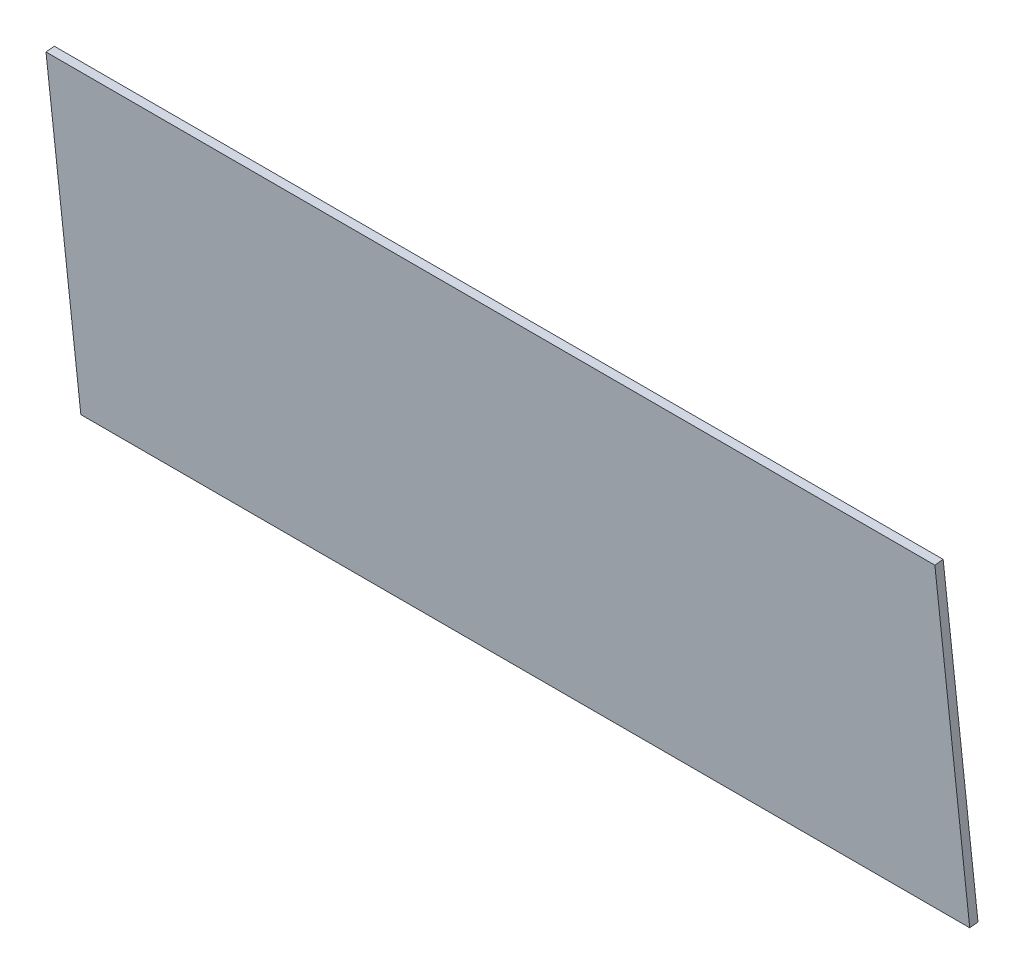
ISO-10303-21;
HEADER;
FILE_DESCRIPTION(('STEP AP214'),'2;1');
FILE_NAME('part.step','',(''),(''),'','','');
FILE_SCHEMA(('AUTOMOTIVE_DESIGN { 1 0 10303 214 1 1 1 1 }'));
ENDSEC;
DATA;
#1=APPLICATION_CONTEXT('core data for automotive mechanical design processes');
#2=APPLICATION_PROTOCOL_DEFINITION('international standard','automotive_design',2000,#1);
#3=PRODUCT_CONTEXT('',#1,'mechanical');
#4=PRODUCT('Part','Part','',(#3));
#5=PRODUCT_RELATED_PRODUCT_CATEGORY('part','',(#4));
#6=PRODUCT_DEFINITION_FORMATION('','',#4);
#7=PRODUCT_DEFINITION_CONTEXT('part definition',#1,'design');
#8=PRODUCT_DEFINITION('design','',#6,#7);
#9=PRODUCT_DEFINITION_SHAPE('','',#8);
#10=(LENGTH_UNIT() NAMED_UNIT(*) SI_UNIT(.MILLI.,.METRE.));
#11=(NAMED_UNIT(*) PLANE_ANGLE_UNIT() SI_UNIT($,.RADIAN.));
#12=(NAMED_UNIT(*) SI_UNIT($,.STERADIAN.) SOLID_ANGLE_UNIT());
#13=UNCERTAINTY_MEASURE_WITH_UNIT(LENGTH_MEASURE(1.E-05),#10,'distance_accuracy_value','');
#14=(GEOMETRIC_REPRESENTATION_CONTEXT(3) GLOBAL_UNCERTAINTY_ASSIGNED_CONTEXT((#13)) GLOBAL_UNIT_ASSIGNED_CONTEXT((#10,
#11,#12)) REPRESENTATION_CONTEXT('',''));
#15=CARTESIAN_POINT('',(0.,0.,0.));
#16=DIRECTION('',(0.,0.,1.));
#17=DIRECTION('',(1.,0.,0.));
#18=AXIS2_PLACEMENT_3D('',#15,#16,#17);
#19=CARTESIAN_POINT('',(-83.0377223575488,-1054.44376842487,-317.862707272272));
#20=DIRECTION('',(1.,0.,0.));
#21=DIRECTION('',(0.,1.,0.));
#22=AXIS2_PLACEMENT_3D('',#19,#20,#21);
#23=PLANE('',#22);
#24=DIRECTION('',(0.,-0.994521895368273,-0.104528463267653));
#25=VECTOR('',#24,1.);
#26=CARTESIAN_POINT('',(-83.0377223575488,-1054.13018303507,-320.846272958377));
#27=LINE('',#26,#25);
#28=CARTESIAN_POINT('',(-83.0377223575488,-1054.13018303507,-320.846272958377));
#29=VERTEX_POINT('',#28);
#30=CARTESIAN_POINT('',(-83.0377223575488,-1173.47281047926,-333.389688550495));
#31=VERTEX_POINT('',#30);
#32=EDGE_CURVE('E100',#29,#31,#27,.T.);
#33=ORIENTED_EDGE('',*,*,#32,.T.);
#34=DIRECTION('',(0.,0.104528463267653,-0.994521895368273));
#35=VECTOR('',#34,1.);
#36=CARTESIAN_POINT('',(-83.0377223575488,-1173.78639586906,-330.406122864391));
#37=LINE('',#36,#35);
#38=CARTESIAN_POINT('',(-83.0377223575488,-1173.78639586906,-330.406122864391));
#39=VERTEX_POINT('',#38);
#40=EDGE_CURVE('E11',#39,#31,#37,.T.);
#41=ORIENTED_EDGE('',*,*,#40,.F.);
#42=DIRECTION('',(0.,-0.994521895368273,-0.104528463267653));
#43=VECTOR('',#42,1.);
#44=CARTESIAN_POINT('',(-83.0377223575488,-1054.44376842487,-317.862707272272));
#45=LINE('',#44,#43);
#46=CARTESIAN_POINT('',(-83.0377223575488,-1054.44376842487,-317.862707272272));
#47=VERTEX_POINT('',#46);
#48=EDGE_CURVE('E88',#47,#39,#45,.T.);
#49=ORIENTED_EDGE('',*,*,#48,.F.);
#50=DIRECTION('',(0.,0.104528463267653,-0.994521895368273));
#51=VECTOR('',#50,1.);
#52=CARTESIAN_POINT('',(-83.0377223575488,-1054.44376842487,-317.862707272272));
#53=LINE('',#52,#51);
#54=EDGE_CURVE('E96',#47,#29,#53,.T.);
#55=ORIENTED_EDGE('',*,*,#54,.T.);
#56=EDGE_LOOP('',(#33,#41,#49,#55));
#57=FACE_BOUND('',#56,.T.);
#58=ADVANCED_FACE('F37',(#57),#23,.F.);
#59=CARTESIAN_POINT('',(-83.0377223575488,-1173.78639586906,-330.406122864391));
#60=DIRECTION('',(0.,0.994521895368273,0.104528463267653));
#61=DIRECTION('',(0.,-0.104528463267653,0.994521895368273));
#62=AXIS2_PLACEMENT_3D('',#59,#60,#61);
#63=PLANE('',#62);
#64=DIRECTION('',(1.,0.,0.));
#65=VECTOR('',#64,1.);
#66=CARTESIAN_POINT('',(-83.0377223575488,-1173.47281047926,-333.389688550495));
#67=LINE('',#66,#65);
#68=CARTESIAN_POINT('',(236.96227764245,-1173.47281047926,-333.389688550496));
#69=VERTEX_POINT('',#68);
#70=EDGE_CURVE('E92',#31,#69,#67,.T.);
#71=ORIENTED_EDGE('',*,*,#70,.T.);
#72=DIRECTION('',(0.,0.104528463267653,-0.994521895368273));
#73=VECTOR('',#72,1.);
#74=CARTESIAN_POINT('',(236.96227764245,-1173.78639586906,-330.406122864391));
#75=LINE('',#74,#73);
#76=CARTESIAN_POINT('',(236.96227764245,-1173.78639586906,-330.406122864391));
#77=VERTEX_POINT('',#76);
#78=EDGE_CURVE('E45',#77,#69,#75,.T.);
#79=ORIENTED_EDGE('',*,*,#78,.F.);
#80=DIRECTION('',(1.,0.,0.));
#81=VECTOR('',#80,1.);
#82=CARTESIAN_POINT('',(-83.0377223575488,-1173.78639586906,-330.406122864391));
#83=LINE('',#82,#81);
#84=EDGE_CURVE('E83',#39,#77,#83,.T.);
#85=ORIENTED_EDGE('',*,*,#84,.F.);
#86=ORIENTED_EDGE('',*,*,#40,.T.);
#87=EDGE_LOOP('',(#71,#79,#85,#86));
#88=FACE_BOUND('',#87,.T.);
#89=ADVANCED_FACE('F91',(#88),#63,.F.);
#90=CARTESIAN_POINT('',(236.962277642451,-1054.44376842487,-317.862707272272));
#91=DIRECTION('',(-1.,0.,0.));
#92=DIRECTION('',(0.,-1.,0.));
#93=AXIS2_PLACEMENT_3D('',#90,#91,#92);
#94=PLANE('',#93);
#95=DIRECTION('',(0.,0.994521895368273,0.104528463267653));
#96=VECTOR('',#95,1.);
#97=CARTESIAN_POINT('',(236.962277642451,-1054.13018303506,-320.846272958377));
#98=LINE('',#97,#96);
#99=CARTESIAN_POINT('',(236.962277642451,-1054.13018303506,-320.846272958377));
#100=VERTEX_POINT('',#99);
#101=EDGE_CURVE('E70',#69,#100,#98,.T.);
#102=ORIENTED_EDGE('',*,*,#101,.T.);
#103=DIRECTION('',(0.,0.104528463267653,-0.994521895368273));
#104=VECTOR('',#103,1.);
#105=CARTESIAN_POINT('',(236.962277642451,-1054.44376842487,-317.862707272272));
#106=LINE('',#105,#104);
#107=CARTESIAN_POINT('',(236.962277642451,-1054.44376842487,-317.862707272272));
#108=VERTEX_POINT('',#107);
#109=EDGE_CURVE('E93',#108,#100,#106,.T.);
#110=ORIENTED_EDGE('',*,*,#109,.F.);
#111=DIRECTION('',(0.,0.994521895368273,0.104528463267653));
#112=VECTOR('',#111,1.);
#113=CARTESIAN_POINT('',(236.962277642451,-1054.44376842487,-317.862707272272));
#114=LINE('',#113,#112);
#115=EDGE_CURVE('E86',#77,#108,#114,.T.);
#116=ORIENTED_EDGE('',*,*,#115,.F.);
#117=ORIENTED_EDGE('',*,*,#78,.T.);
#118=EDGE_LOOP('',(#102,#110,#116,#117));
#119=FACE_BOUND('',#118,.T.);
#120=ADVANCED_FACE('F94',(#119),#94,.F.);
#121=CARTESIAN_POINT('',(-83.0377223575488,-1054.44376842487,-317.862707272272));
#122=DIRECTION('',(0.,-0.994521895368273,-0.104528463267653));
#123=DIRECTION('',(0.,0.104528463267653,-0.994521895368273));
#124=AXIS2_PLACEMENT_3D('',#121,#122,#123);
#125=PLANE('',#124);
#126=DIRECTION('',(-1.,0.,0.));
#127=VECTOR('',#126,1.);
#128=CARTESIAN_POINT('',(-83.0377223575488,-1054.13018303507,-320.846272958377));
#129=LINE('',#128,#127);
#130=EDGE_CURVE('E76',#100,#29,#129,.T.);
#131=ORIENTED_EDGE('',*,*,#130,.T.);
#132=ORIENTED_EDGE('',*,*,#54,.F.);
#133=DIRECTION('',(-1.,0.,0.));
#134=VECTOR('',#133,1.);
#135=CARTESIAN_POINT('',(-83.0377223575488,-1054.44376842487,-317.862707272272));
#136=LINE('',#135,#134);
#137=EDGE_CURVE('E53',#108,#47,#136,.T.);
#138=ORIENTED_EDGE('',*,*,#137,.F.);
#139=ORIENTED_EDGE('',*,*,#109,.T.);
#140=EDGE_LOOP('',(#131,#132,#138,#139));
#141=FACE_BOUND('',#140,.T.);
#142=ADVANCED_FACE('F107',(#141),#125,.F.);
#143=CARTESIAN_POINT('',(0.,21.5226233427589,-204.774082493967));
#144=DIRECTION('',(0.,-0.104528463267653,0.994521895368273));
#145=DIRECTION('',(0.,-0.994521895368273,-0.104528463267653));
#146=AXIS2_PLACEMENT_3D('',#143,#144,#145);
#147=PLANE('',#146);
#148=ORIENTED_EDGE('',*,*,#48,.T.);
#149=ORIENTED_EDGE('',*,*,#84,.T.);
#150=ORIENTED_EDGE('',*,*,#115,.T.);
#151=ORIENTED_EDGE('',*,*,#137,.T.);
#152=EDGE_LOOP('',(#148,#149,#150,#151));
#153=FACE_BOUND('',#152,.T.);
#154=ADVANCED_FACE('F84',(#153),#147,.T.);
#155=CARTESIAN_POINT('',(0.,21.8362087325619,-207.757648180072));
#156=DIRECTION('',(0.,-0.104528463267653,0.994521895368273));
#157=DIRECTION('',(0.,-0.994521895368273,-0.104528463267653));
#158=AXIS2_PLACEMENT_3D('',#155,#156,#157);
#159=PLANE('',#158);
#160=ORIENTED_EDGE('',*,*,#32,.F.);
#161=ORIENTED_EDGE('',*,*,#130,.F.);
#162=ORIENTED_EDGE('',*,*,#101,.F.);
#163=ORIENTED_EDGE('',*,*,#70,.F.);
#164=EDGE_LOOP('',(#160,#161,#162,#163));
#165=FACE_BOUND('',#164,.T.);
#166=ADVANCED_FACE('F110',(#165),#159,.F.);
#167=CLOSED_SHELL('',(#58,#89,#120,#142,#154,#166));
#168=MANIFOLD_SOLID_BREP('B2',#167);
#169=ADVANCED_BREP_SHAPE_REPRESENTATION('',(#18,#168),#14);
#170=SHAPE_DEFINITION_REPRESENTATION(#9,#169);
ENDSEC;
END-ISO-10303-21;
